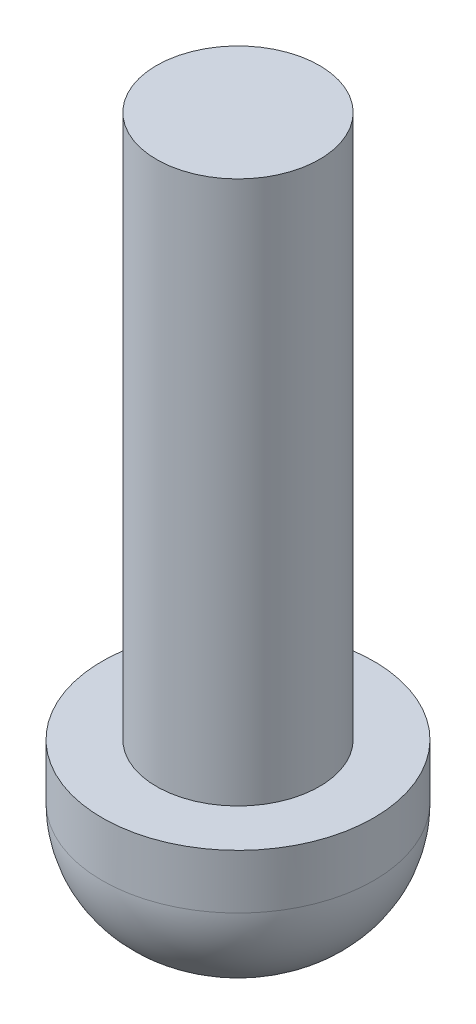
ISO-10303-21;
HEADER;
FILE_DESCRIPTION(('STEP AP214'),'2;1');
FILE_NAME('part.step','',(''),(''),'','','');
FILE_SCHEMA(('AUTOMOTIVE_DESIGN { 1 0 10303 214 1 1 1 1 }'));
ENDSEC;
DATA;
#1=APPLICATION_CONTEXT('core data for automotive mechanical design processes');
#2=APPLICATION_PROTOCOL_DEFINITION('international standard','automotive_design',2000,#1);
#3=PRODUCT_CONTEXT('',#1,'mechanical');
#4=PRODUCT('Part','Part','',(#3));
#5=PRODUCT_RELATED_PRODUCT_CATEGORY('part','',(#4));
#6=PRODUCT_DEFINITION_FORMATION('','',#4);
#7=PRODUCT_DEFINITION_CONTEXT('part definition',#1,'design');
#8=PRODUCT_DEFINITION('design','',#6,#7);
#9=PRODUCT_DEFINITION_SHAPE('','',#8);
#10=(LENGTH_UNIT() NAMED_UNIT(*) SI_UNIT(.MILLI.,.METRE.));
#11=(NAMED_UNIT(*) PLANE_ANGLE_UNIT() SI_UNIT($,.RADIAN.));
#12=(NAMED_UNIT(*) SI_UNIT($,.STERADIAN.) SOLID_ANGLE_UNIT());
#13=UNCERTAINTY_MEASURE_WITH_UNIT(LENGTH_MEASURE(1.E-05),#10,'distance_accuracy_value','');
#14=(GEOMETRIC_REPRESENTATION_CONTEXT(3) GLOBAL_UNCERTAINTY_ASSIGNED_CONTEXT((#13)) GLOBAL_UNIT_ASSIGNED_CONTEXT((#10,
#11,#12)) REPRESENTATION_CONTEXT('',''));
#15=CARTESIAN_POINT('',(0.,0.,0.));
#16=DIRECTION('',(0.,0.,1.));
#17=DIRECTION('',(1.,0.,0.));
#18=AXIS2_PLACEMENT_3D('',#15,#16,#17);
#19=CARTESIAN_POINT('',(0.,10.,0.));
#20=DIRECTION('',(0.,1.,0.));
#21=DIRECTION('',(1.,0.,0.));
#22=AXIS2_PLACEMENT_3D('',#19,#20,#21);
#23=PLANE('',#22);
#24=CARTESIAN_POINT('',(0.,10.,0.));
#25=DIRECTION('',(0.,1.,0.));
#26=DIRECTION('',(1.,0.,0.));
#27=AXIS2_PLACEMENT_3D('',#24,#25,#26);
#28=CIRCLE('',#27,1.5);
#29=CARTESIAN_POINT('',(-1.5,10.,0.));
#30=VERTEX_POINT('',#29);
#31=EDGE_CURVE('E11',#30,#30,#28,.T.);
#32=ORIENTED_EDGE('',*,*,#31,.T.);
#33=EDGE_LOOP('',(#32));
#34=FACE_BOUND('',#33,.T.);
#35=ADVANCED_FACE('F17',(#34),#23,.T.);
#36=CARTESIAN_POINT('',(0.,0.,0.));
#37=DIRECTION('',(0.,1.,0.));
#38=DIRECTION('',(1.,0.,0.));
#39=AXIS2_PLACEMENT_3D('',#36,#37,#38);
#40=CYLINDRICAL_SURFACE('',#39,1.5);
#41=CARTESIAN_POINT('',(0.,0.,0.));
#42=DIRECTION('',(0.,-1.,0.));
#43=DIRECTION('',(1.,0.,0.));
#44=AXIS2_PLACEMENT_3D('',#41,#42,#43);
#45=CIRCLE('',#44,1.5);
#46=CARTESIAN_POINT('',(-1.5,0.,0.));
#47=VERTEX_POINT('',#46);
#48=EDGE_CURVE('E30',#47,#47,#45,.T.);
#49=ORIENTED_EDGE('',*,*,#48,.F.);
#50=EDGE_LOOP('',(#49));
#51=FACE_BOUND('',#50,.T.);
#52=ORIENTED_EDGE('',*,*,#31,.F.);
#53=EDGE_LOOP('',(#52));
#54=FACE_BOUND('',#53,.T.);
#55=ADVANCED_FACE('F592',(#51,#54),#40,.T.);
#56=CARTESIAN_POINT('',(0.,0.,0.));
#57=DIRECTION('',(0.,1.,0.));
#58=DIRECTION('',(1.,0.,0.));
#59=AXIS2_PLACEMENT_3D('',#56,#57,#58);
#60=PLANE('',#59);
#61=ORIENTED_EDGE('',*,*,#48,.T.);
#62=EDGE_LOOP('',(#61));
#63=FACE_BOUND('',#62,.T.);
#64=CARTESIAN_POINT('',(0.,0.,0.));
#65=DIRECTION('',(0.,1.,0.));
#66=DIRECTION('',(-1.,0.,0.));
#67=AXIS2_PLACEMENT_3D('',#64,#65,#66);
#68=CIRCLE('',#67,2.5);
#69=CARTESIAN_POINT('',(2.5,0.,0.));
#70=VERTEX_POINT('',#69);
#71=EDGE_CURVE('E90',#70,#70,#68,.T.);
#72=ORIENTED_EDGE('',*,*,#71,.T.);
#73=EDGE_LOOP('',(#72));
#74=FACE_BOUND('',#73,.T.);
#75=ADVANCED_FACE('F89',(#63,#74),#60,.T.);
#76=CARTESIAN_POINT('',(0.,0.,0.));
#77=DIRECTION('',(0.,-1.,0.));
#78=DIRECTION('',(-1.,0.,0.));
#79=AXIS2_PLACEMENT_3D('',#76,#77,#78);
#80=CYLINDRICAL_SURFACE('',#79,2.5);
#81=CARTESIAN_POINT('',(0.,-1.,0.));
#82=DIRECTION('',(0.,-1.,0.));
#83=DIRECTION('',(-1.,0.,0.));
#84=AXIS2_PLACEMENT_3D('',#81,#82,#83);
#85=CIRCLE('',#84,2.5);
#86=CARTESIAN_POINT('',(2.5,-1.,0.));
#87=VERTEX_POINT('',#86);
#88=CARTESIAN_POINT('',(0.,-1.,2.5));
#89=VERTEX_POINT('',#88);
#90=EDGE_CURVE('E105',#87,#89,#85,.T.);
#91=ORIENTED_EDGE('',*,*,#90,.F.);
#92=CARTESIAN_POINT('',(0.,-1.,0.));
#93=DIRECTION('',(0.,-1.,0.));
#94=DIRECTION('',(-1.,0.,0.));
#95=AXIS2_PLACEMENT_3D('',#92,#93,#94);
#96=CIRCLE('',#95,2.5);
#97=EDGE_CURVE('E163',#89,#87,#96,.T.);
#98=ORIENTED_EDGE('',*,*,#97,.F.);
#99=EDGE_LOOP('',(#91,#98));
#100=FACE_BOUND('',#99,.T.);
#101=ORIENTED_EDGE('',*,*,#71,.F.);
#102=EDGE_LOOP('',(#101));
#103=FACE_BOUND('',#102,.T.);
#104=ADVANCED_FACE('F603',(#100,#103),#80,.T.);
#105=CARTESIAN_POINT('',(-0.417386632650924,-3.,-0.275296928577712));
#106=DIRECTION('',(-0.186616509751668,0.,-0.982432836527824));
#107=DIRECTION('',(-0.982432836527824,0.,0.186616509751668));
#108=AXIS2_PLACEMENT_3D('',#105,#106,#107);
#109=PLANE('',#108);
#110=CARTESIAN_POINT('',(-0.417386632650925,-3.,-0.275296928577712));
#111=CARTESIAN_POINT('',(-0.464273853389436,-3.00005642598224,-0.266670561788805));
#112=CARTESIAN_POINT('',(-0.511235587988266,-2.99909377306004,-0.258377785632426));
#113=CARTESIAN_POINT('',(-0.58596288848384,-2.99557387268779,-0.245105474283203));
#114=CARTESIAN_POINT('',(-0.613773090441924,-2.99382371647033,-0.240149160618557));
#115=CARTESIAN_POINT('',(-0.672466754636964,-2.98909389705395,-0.2294782633294));
#116=CARTESIAN_POINT('',(-0.703337058922493,-2.98599628789804,-0.223741887504033));
#117=CARTESIAN_POINT('',(-0.768216193048915,-2.97812446927156,-0.211471842716828));
#118=CARTESIAN_POINT('',(-0.802203849820698,-2.97320529961422,-0.204918983019769));
#119=CARTESIAN_POINT('',(-0.873322480074087,-2.96115559356099,-0.191033985735932));
#120=CARTESIAN_POINT('',(-0.910422173401683,-2.95385122469379,-0.183690286675776));
#121=CARTESIAN_POINT('',(-0.967043903220003,-2.94107829526599,-0.172445263892615));
#122=CARTESIAN_POINT('',(-0.98672862286903,-2.93633226116336,-0.168528934690961));
#123=CARTESIAN_POINT('',(-1.02684248375918,-2.92602530775528,-0.160557802443036));
#124=CARTESIAN_POINT('',(-1.04726503280705,-2.92043724326718,-0.156504746465074));
#125=CARTESIAN_POINT('',(-1.08882774657363,-2.9083570372805,-0.148289928587405));
#126=CARTESIAN_POINT('',(-1.10996011320697,-2.90183599817425,-0.144131192457723));
#127=CARTESIAN_POINT('',(-1.1529104115441,-2.88779583680887,-0.135754660282906));
#128=CARTESIAN_POINT('',(-1.17471931008087,-2.88024607490424,-0.131541865734934));
#129=CARTESIAN_POINT('',(-1.2211539210414,-2.86325897981294,-0.12264400288936));
#130=CARTESIAN_POINT('',(-1.24574070789602,-2.85370578133819,-0.117976638027123));
#131=CARTESIAN_POINT('',(-1.29623981891198,-2.83291509860176,-0.108399373770314));
#132=CARTESIAN_POINT('',(-1.32212399166951,-2.82160644966243,-0.103495457070596));
#133=CARTESIAN_POINT('',(-1.37510151094352,-2.79709493579706,-0.0934633405284698));
#134=CARTESIAN_POINT('',(-1.40216103816665,-2.78381615675037,-0.0883418668038786));
#135=CARTESIAN_POINT('',(-1.45733645135766,-2.75515195226108,-0.0778892550639663));
#136=CARTESIAN_POINT('',(-1.48541218894427,-2.73968664221135,-0.0725651056931595));
#137=CARTESIAN_POINT('',(-1.54243049731679,-2.70643789023548,-0.0617395572178182));
#138=CARTESIAN_POINT('',(-1.57132625492958,-2.68857146814507,-0.0562462751712473));
#139=CARTESIAN_POINT('',(-1.62975441496184,-2.65031763998745,-0.0451271286847165));
#140=CARTESIAN_POINT('',(-1.65923309423636,-2.62984534174343,-0.0395108360283896));
#141=CARTESIAN_POINT('',(-1.71855417082615,-2.58619309039993,-0.0282046268317497));
#142=CARTESIAN_POINT('',(-1.74833591865345,-2.56292772800826,-0.0225260404351624));
#143=CARTESIAN_POINT('',(-1.80794843911035,-2.51353091370533,-0.0111678305547711));
#144=CARTESIAN_POINT('',(-1.83771200470389,-2.4873152839304,-0.00550142335331249));
#145=CARTESIAN_POINT('',(-1.86667288706595,-2.46020725233058,0.));
#146=B_SPLINE_CURVE_WITH_KNOTS('',3,(#110,#111,#112,#113,#114,#115,#116,#117,#118,#119,#120,
#121,#122,#123,#124,#125,#126,#127,#128,#129,#130,#131,#132,#133,#134,#135,#136,#137,#138,#139,
#140,#141,#142,#143,#144,#145),.UNSPECIFIED.,.F.,.F.,(4,2,2,2,2,2,2,2,2,2,2,2,2,2,2,2,2,4),(0.,
0.143022375074927,0.227917127496093,0.322543845999278,0.42739192817745,0.542887042197384,
0.604751783126982,0.669414207103448,0.736911873290066,0.807278150500668,0.88761887627633,
0.973601011306392,1.06529182557611,1.16273178046567,1.26592963372248,1.37485700559365,
1.4894426502269,1.60956672638445),.UNSPECIFIED.);
#147=CARTESIAN_POINT('',(-0.417386632650925,-3.,-0.275296928577712));
#148=VERTEX_POINT('',#147);
#149=CARTESIAN_POINT('',(-1.86667288706595,-2.46020725233058,0.));
#150=VERTEX_POINT('',#149);
#151=EDGE_CURVE('E424',#148,#150,#146,.T.);
#152=ORIENTED_EDGE('',*,*,#151,.F.);
#153=DIRECTION('',(0.,1.,0.));
#154=VECTOR('',#153,1.);
#155=CARTESIAN_POINT('',(-0.417386632650925,-3.,-0.275296928577712));
#156=LINE('',#155,#154);
#157=CARTESIAN_POINT('',(-0.417386632650925,-1.,-0.275296928577712));
#158=VERTEX_POINT('',#157);
#159=EDGE_CURVE('E401',#148,#158,#156,.T.);
#160=ORIENTED_EDGE('',*,*,#159,.T.);
#161=DIRECTION('',(-0.982432836527824,0.,0.186616509751668));
#162=VECTOR('',#161,1.);
#163=CARTESIAN_POINT('',(-1.86667288706595,-1.,0.));
#164=LINE('',#163,#162);
#165=CARTESIAN_POINT('',(-1.86667288706595,-1.,0.));
#166=VERTEX_POINT('',#165);
#167=EDGE_CURVE('E153',#158,#166,#164,.T.);
#168=ORIENTED_EDGE('',*,*,#167,.T.);
#169=DIRECTION('',(0.,1.,0.));
#170=VECTOR('',#169,1.);
#171=CARTESIAN_POINT('',(-1.86667288706595,-3.,0.));
#172=LINE('',#171,#170);
#173=EDGE_CURVE('E91',#150,#166,#172,.T.);
#174=ORIENTED_EDGE('',*,*,#173,.F.);
#175=EDGE_LOOP('',(#152,#160,#168,#174));
#176=FACE_BOUND('',#175,.T.);
#177=ADVANCED_FACE('F200',(#176),#109,.F.);
#178=CARTESIAN_POINT('',(-0.417386632650924,-3.,0.275296928577712));
#179=DIRECTION('',(0.186616509751668,0.,-0.982432836527824));
#180=DIRECTION('',(0.,-1.,0.));
#181=AXIS2_PLACEMENT_3D('',#178,#179,#180);
#182=PLANE('',#181);
#183=CARTESIAN_POINT('',(-1.86667288706595,-2.46020725233058,0.));
#184=CARTESIAN_POINT('',(-1.8377182513495,-2.48730943545658,0.00550023057495743));
#185=CARTESIAN_POINT('',(-1.80796130126467,-2.51351958266544,0.0111655815361506));
#186=CARTESIAN_POINT('',(-1.74836071527282,-2.56290781316947,0.0225221958720095));
#187=CARTESIAN_POINT('',(-1.71858418104794,-2.58616994326433,0.028200250640021));
#188=CARTESIAN_POINT('',(-1.65927187348047,-2.62981776130239,0.0395058342102261));
#189=CARTESIAN_POINT('',(-1.62979666125676,-2.65028873222602,0.0451220423259053));
#190=CARTESIAN_POINT('',(-1.57137350253646,-2.68854157188077,0.0562413429384201));
#191=CARTESIAN_POINT('',(-1.54247920764307,-2.70640821466527,0.0617348772549942));
#192=CARTESIAN_POINT('',(-1.48546170194053,-2.73965871393465,0.0725611290766999));
#193=CARTESIAN_POINT('',(-1.45738524845235,-2.75512544308298,0.0778857489333687));
#194=CARTESIAN_POINT('',(-1.40220615810483,-2.78379345586383,0.0883393283925251));
#195=CARTESIAN_POINT('',(-1.37514362835924,-2.7970745286354,0.0934613287299921));
#196=CARTESIAN_POINT('',(-1.32215781161119,-2.82159128710229,0.103494439289411));
#197=CARTESIAN_POINT('',(-1.29626831494911,-2.83290280480535,0.108398860123462));
#198=CARTESIAN_POINT('',(-1.24575621168436,-2.8536996426799,0.117976629246365));
#199=CARTESIAN_POINT('',(-1.22116174170851,-2.86325605692106,0.122644062782587));
#200=CARTESIAN_POINT('',(-1.17472040343866,-2.88024572909231,0.131540291714795));
#201=CARTESIAN_POINT('',(-1.15291258672524,-2.88779520018727,0.135751370983225));
#202=CARTESIAN_POINT('',(-1.10996437277675,-2.90183486829558,0.144125058102641));
#203=CARTESIAN_POINT('',(-1.08883300353616,-2.90835569919574,0.14828264519185));
#204=CARTESIAN_POINT('',(-1.04727215898853,-2.92043558089303,0.156495490981718));
#205=CARTESIAN_POINT('',(-1.02685047820729,-2.92602352306661,0.160547713874002));
#206=CARTESIAN_POINT('',(-0.986738223809797,-2.93633030302391,0.168517515402044));
#207=CARTESIAN_POINT('',(-0.967054238894512,-2.94107628035024,0.172433335577649));
#208=CARTESIAN_POINT('',(-0.910434217694771,-2.95384918141395,0.183677323304803));
#209=CARTESIAN_POINT('',(-0.873335551202937,-2.96115357858895,0.191020784534667));
#210=CARTESIAN_POINT('',(-0.802218352843852,-2.97320349013574,0.204906141553028));
#211=CARTESIAN_POINT('',(-0.768231083617263,-2.97812280169535,0.21145953353553));
#212=CARTESIAN_POINT('',(-0.703352060656074,-2.98599497105249,0.223731143278222));
#213=CARTESIAN_POINT('',(-0.672481469345751,-2.98909276070816,0.229468506917461));
#214=CARTESIAN_POINT('',(-0.613786561606485,-2.99382294785161,0.240141604535061));
#215=CARTESIAN_POINT('',(-0.585975398214346,-2.99557326943426,0.245099105955014));
#216=CARTESIAN_POINT('',(-0.511243365548929,-2.99909363266535,0.258374756279598));
#217=CARTESIAN_POINT('',(-0.464277820052036,-3.00005641655402,0.266669527671575));
#218=CARTESIAN_POINT('',(-0.417386632650924,-3.,0.275296928577712));
#219=B_SPLINE_CURVE_WITH_KNOTS('',3,(#183,#184,#185,#186,#187,#188,#189,#190,#191,#192,#193,
#194,#195,#196,#197,#198,#199,#200,#201,#202,#203,#204,#205,#206,#207,#208,#209,#210,#211,#212,
#213,#214,#215,#216,#217,#218),.UNSPECIFIED.,.F.,.F.,(4,2,2,2,2,2,2,2,2,2,2,2,2,2,2,2,2,4),(0.,
0.120098167701528,0.234665511610209,0.343582175485884,0.446776813545414,0.544220878492738,
0.635922908244617,0.72192310444428,0.802288446028236,0.872650503352188,0.94014454021708,
1.00480393221331,1.06666624007608,1.18215826996053,1.28700558328205,1.38163373681147,
1.46653197719137,1.60956663764364),.UNSPECIFIED.);
#220=CARTESIAN_POINT('',(-0.417386632650925,-3.,0.275296928577712));
#221=VERTEX_POINT('',#220);
#222=EDGE_CURVE('E176',#150,#221,#219,.T.);
#223=ORIENTED_EDGE('',*,*,#222,.F.);
#224=ORIENTED_EDGE('',*,*,#173,.T.);
#225=DIRECTION('',(-0.982432836527824,0.,-0.186616509751668));
#226=VECTOR('',#225,1.);
#227=CARTESIAN_POINT('',(-1.86667288706595,-1.,0.));
#228=LINE('',#227,#226);
#229=CARTESIAN_POINT('',(-0.417386632650925,-1.,0.275296928577712));
#230=VERTEX_POINT('',#229);
#231=EDGE_CURVE('E149',#230,#166,#228,.T.);
#232=ORIENTED_EDGE('',*,*,#231,.F.);
#233=DIRECTION('',(0.,1.,0.));
#234=VECTOR('',#233,1.);
#235=CARTESIAN_POINT('',(-0.417386632650925,-3.,0.275296928577712));
#236=LINE('',#235,#234);
#237=EDGE_CURVE('E126',#221,#230,#236,.T.);
#238=ORIENTED_EDGE('',*,*,#237,.F.);
#239=EDGE_LOOP('',(#223,#224,#232,#238));
#240=FACE_BOUND('',#239,.T.);
#241=ADVANCED_FACE('F198',(#240),#182,.T.);
#242=CARTESIAN_POINT('',(0.,-1.,2.5));
#243=CARTESIAN_POINT('',(-2.5,-1.,2.5));
#244=CARTESIAN_POINT('',(-2.5,-1.,0.));
#245=CARTESIAN_POINT('',(-2.5,-1.,-2.5));
#246=CARTESIAN_POINT('',(0.,-1.,-2.5));
#247=CARTESIAN_POINT('',(2.5,-1.,-2.5));
#248=CARTESIAN_POINT('',(2.5,-1.,0.));
#249=CARTESIAN_POINT('',(2.5,-1.,2.5));
#250=CARTESIAN_POINT('',(0.,-1.,2.5));
#251=CARTESIAN_POINT('',(0.,-3.,2.5));
#252=CARTESIAN_POINT('',(-2.5,-3.,2.5));
#253=CARTESIAN_POINT('',(-2.5,-3.,0.));
#254=CARTESIAN_POINT('',(-2.5,-3.,-2.5));
#255=CARTESIAN_POINT('',(0.,-3.,-2.5));
#256=CARTESIAN_POINT('',(2.5,-3.,-2.5));
#257=CARTESIAN_POINT('',(2.5,-3.,0.));
#258=CARTESIAN_POINT('',(2.5,-3.,2.5));
#259=CARTESIAN_POINT('',(0.,-3.,2.5));
#260=CARTESIAN_POINT('',(0.,-3.,0.5));
#261=CARTESIAN_POINT('',(-0.499999999999999,-3.,0.499999999999999));
#262=CARTESIAN_POINT('',(-0.5,-3.,0.));
#263=CARTESIAN_POINT('',(-0.499999999999999,-3.,-0.499999999999999));
#264=CARTESIAN_POINT('',(0.,-3.,-0.5));
#265=CARTESIAN_POINT('',(0.499999999999999,-3.,-0.499999999999999));
#266=CARTESIAN_POINT('',(0.5,-3.,0.));
#267=CARTESIAN_POINT('',(0.499999999999999,-3.,0.499999999999999));
#268=CARTESIAN_POINT('',(0.,-3.,0.5));
#269=(BOUNDED_SURFACE() B_SPLINE_SURFACE(2,2,((#242,#243,#244,#245,#246,#247,#248,#249,#250),
(#251,#252,#253,#254,#255,#256,#257,#258,#259),(#260,#261,#262,#263,#264,#265,#266,#267,#268)),
.UNSPECIFIED.,.F.,.T.,.F.) B_SPLINE_SURFACE_WITH_KNOTS((3,3),(3,2,2,2,3),(0.,1.5707963267949),
(-3.14159265358979,-1.5707963267949,0.,1.5707963267949,3.14159265358979),
.UNSPECIFIED.) GEOMETRIC_REPRESENTATION_ITEM() RATIONAL_B_SPLINE_SURFACE(((1.,0.707106781186548,
1.,0.707106781186548,1.,0.707106781186548,1.,0.707106781186548,1.),(0.707106781186548,0.5,
0.707106781186548,0.5,0.707106781186548,0.5,0.707106781186548,0.5,0.707106781186548),(1.,
0.707106781186548,1.,0.707106781186548,1.,0.707106781186548,1.,0.707106781186548,1.))) REPRESENTATION_ITEM('') SURFACE());
#270=CARTESIAN_POINT('',(0.,-2.46020725233058,1.86667288706595));
#271=CARTESIAN_POINT('',(0.00550023057495841,-2.48730943545658,1.8377182513495));
#272=CARTESIAN_POINT('',(0.0111655815361515,-2.51351958266544,1.80796130126467));
#273=CARTESIAN_POINT('',(0.0225221958720098,-2.56290781316947,1.74836071527282));
#274=CARTESIAN_POINT('',(0.0282002506400208,-2.58616994326433,1.71858418104794));
#275=CARTESIAN_POINT('',(0.0395058342102259,-2.6298177613024,1.65927187348047));
#276=CARTESIAN_POINT('',(0.0451220423259054,-2.65028873222602,1.62979666125677));
#277=CARTESIAN_POINT('',(0.0562413429384205,-2.68854157188077,1.57137350253646));
#278=CARTESIAN_POINT('',(0.0617348772549946,-2.70640821466527,1.54247920764307));
#279=CARTESIAN_POINT('',(0.0725611290767003,-2.73965871393465,1.48546170194053));
#280=CARTESIAN_POINT('',(0.0778857489333692,-2.75512544308298,1.45738524845235));
#281=CARTESIAN_POINT('',(0.0883393283925252,-2.78379345586383,1.40220615810483));
#282=CARTESIAN_POINT('',(0.0934613287299919,-2.7970745286354,1.37514362835924));
#283=CARTESIAN_POINT('',(0.103494439289411,-2.82159128710229,1.32215781161119));
#284=CARTESIAN_POINT('',(0.108398860123462,-2.83290280480535,1.29626831494911));
#285=CARTESIAN_POINT('',(0.117976629246366,-2.8536996426799,1.24575621168436));
#286=CARTESIAN_POINT('',(0.122644062782587,-2.86325605692106,1.22116174170851));
#287=CARTESIAN_POINT('',(0.131540291714795,-2.88024572909231,1.17472040343866));
#288=CARTESIAN_POINT('',(0.135751370983225,-2.88779520018727,1.15291258672524));
#289=CARTESIAN_POINT('',(0.14412505810264,-2.90183486829558,1.10996437277675));
#290=CARTESIAN_POINT('',(0.14828264519185,-2.90835569919574,1.08883300353616));
#291=CARTESIAN_POINT('',(0.156495490981717,-2.92043558089303,1.04727215898853));
#292=CARTESIAN_POINT('',(0.160547713874002,-2.92602352306661,1.02685047820729));
#293=CARTESIAN_POINT('',(0.168517515402044,-2.93633030302391,0.986738223809797));
#294=CARTESIAN_POINT('',(0.172433335577649,-2.94107628035024,0.967054238894512));
#295=CARTESIAN_POINT('',(0.183677323304803,-2.95384918141395,0.910434217694771));
#296=CARTESIAN_POINT('',(0.191020784534667,-2.96115357858895,0.873335551202937));
#297=CARTESIAN_POINT('',(0.204906141553028,-2.97320349013574,0.802218352843852));
#298=CARTESIAN_POINT('',(0.21145953353553,-2.97812280169535,0.768231083617263));
#299=CARTESIAN_POINT('',(0.223731143278222,-2.98599497105249,0.703352060656074));
#300=CARTESIAN_POINT('',(0.229468506917461,-2.98909276070816,0.672481469345751));
#301=CARTESIAN_POINT('',(0.240141604535061,-2.99382294785161,0.613786561606485));
#302=CARTESIAN_POINT('',(0.245099105955014,-2.99557326943426,0.585975398214346));
#303=CARTESIAN_POINT('',(0.258374756279598,-2.99909363266535,0.511243365548928));
#304=CARTESIAN_POINT('',(0.266669527671575,-3.00005641655402,0.464277820052036));
#305=CARTESIAN_POINT('',(0.275296928577712,-3.,0.417386632650924));
#306=B_SPLINE_CURVE_WITH_KNOTS('',3,(#270,#271,#272,#273,#274,#275,#276,#277,#278,#279,#280,
#281,#282,#283,#284,#285,#286,#287,#288,#289,#290,#291,#292,#293,#294,#295,#296,#297,#298,#299,
#300,#301,#302,#303,#304,#305),.UNSPECIFIED.,.F.,.F.,(4,2,2,2,2,2,2,2,2,2,2,2,2,2,2,2,2,4),(0.,
0.120098167701527,0.234665511610208,0.343582175485883,0.446776813545412,0.544220878492737,
0.635922908244616,0.721923104444279,0.802288446028236,0.872650503352189,0.94014454021708,
1.00480393221331,1.06666624007608,1.18215826996053,1.28700558328205,1.38163373681148,
1.46653197719137,1.60956663764364),.UNSPECIFIED.);
#307=CARTESIAN_POINT('',(0.,-2.46020725233058,1.86667288706595));
#308=VERTEX_POINT('',#307);
#309=CARTESIAN_POINT('',(0.275296928577712,-3.,0.417386632650925));
#310=VERTEX_POINT('',#309);
#311=EDGE_CURVE('E130',#308,#310,#306,.T.);
#312=CARTESIAN_POINT('',(0.,-3.,0.));
#313=DIRECTION('',(0.,1.,0.));
#314=DIRECTION('',(-1.,0.,0.));
#315=AXIS2_PLACEMENT_3D('',#312,#313,#314);
#316=CIRCLE('',#315,0.5);
#317=CARTESIAN_POINT('',(0.417386632650925,-3.,0.275296928577712));
#318=VERTEX_POINT('',#317);
#319=EDGE_CURVE('E308',#310,#318,#316,.T.);
#320=CARTESIAN_POINT('',(0.417386632650924,-3.,0.275296928577712));
#321=CARTESIAN_POINT('',(0.464273853389483,-3.00005642598224,0.266670561788793));
#322=CARTESIAN_POINT('',(0.511235587988359,-2.99909377306003,0.258377785632391));
#323=CARTESIAN_POINT('',(0.58596288848399,-2.99557387268778,0.245105474283129));
#324=CARTESIAN_POINT('',(0.613773090442085,-2.99382371647032,0.240149160618468));
#325=CARTESIAN_POINT('',(0.67246675463714,-2.98909389705394,0.229478263329285));
#326=CARTESIAN_POINT('',(0.703337058922673,-2.98599628789802,0.223741887503906));
#327=CARTESIAN_POINT('',(0.768216193049093,-2.97812446927154,0.211471842716682));
#328=CARTESIAN_POINT('',(0.802203849820872,-2.9732052996142,0.204918983019617));
#329=CARTESIAN_POINT('',(0.873322480074243,-2.96115559356096,0.191033985735776));
#330=CARTESIAN_POINT('',(0.910422173401827,-2.95385122469377,0.183690286675623));
#331=CARTESIAN_POINT('',(0.967043903220127,-2.94107829526596,0.172445263892474));
#332=CARTESIAN_POINT('',(0.986728622869144,-2.93633226116334,0.168528934690826));
#333=CARTESIAN_POINT('',(1.02684248375927,-2.92602530775526,0.160557802442916));
#334=CARTESIAN_POINT('',(1.04726503280713,-2.92043724326716,0.156504746464964));
#335=CARTESIAN_POINT('',(1.08882774657369,-2.90835703728049,0.148289928587319));
#336=CARTESIAN_POINT('',(1.10996011320702,-2.90183599817424,0.144131192457651));
#337=CARTESIAN_POINT('',(1.15291041154412,-2.88779583680886,0.135754660282867));
#338=CARTESIAN_POINT('',(1.17471931008088,-2.88024607490424,0.131541865734916));
#339=CARTESIAN_POINT('',(1.22115392104149,-2.8632589798129,0.122644002889361));
#340=CARTESIAN_POINT('',(1.24574070789621,-2.85370578133812,0.117976638027124));
#341=CARTESIAN_POINT('',(1.29623981891232,-2.83291509860161,0.108399373770309));
#342=CARTESIAN_POINT('',(1.32212399166991,-2.82160644966225,0.103495457070585));
#343=CARTESIAN_POINT('',(1.37510151094403,-2.79709493579681,0.0934633405284467));
#344=CARTESIAN_POINT('',(1.40216103816719,-2.7838161567501,0.0883418668038493));
#345=CARTESIAN_POINT('',(1.45733645135824,-2.75515195226077,0.0778892550639257));
#346=CARTESIAN_POINT('',(1.48541218894486,-2.73968664221102,0.0725651056931135));
#347=CARTESIAN_POINT('',(1.54243049731737,-2.70643789023512,0.0617395572177638));
#348=CARTESIAN_POINT('',(1.57132625493015,-2.68857146814471,0.0562462751711897));
#349=CARTESIAN_POINT('',(1.62975441496234,-2.6503176399871,0.0451271286846565));
#350=CARTESIAN_POINT('',(1.65923309423682,-2.6298453417431,0.0395108360283303));
#351=CARTESIAN_POINT('',(1.71855417082651,-2.58619309039966,0.028204626831698));
#352=CARTESIAN_POINT('',(1.74833591865375,-2.56292772800802,0.0225260404351173));
#353=CARTESIAN_POINT('',(1.80794843911051,-2.51353091370519,0.0111678305547452));
#354=CARTESIAN_POINT('',(1.83771200470396,-2.48731528393033,0.00550142335329907));
#355=CARTESIAN_POINT('',(1.86667288706595,-2.46020725233058,0.));
#356=B_SPLINE_CURVE_WITH_KNOTS('',3,(#320,#321,#322,#323,#324,#325,#326,#327,#328,#329,#330,
#331,#332,#333,#334,#335,#336,#337,#338,#339,#340,#341,#342,#343,#344,#345,#346,#347,#348,#349,
#350,#351,#352,#353,#354,#355),.UNSPECIFIED.,.F.,.F.,(4,2,2,2,2,2,2,2,2,2,2,2,2,2,2,2,2,4),(0.,
0.143022375075074,0.227917127496282,0.322543845999484,0.427391928177647,0.542887042197544,
0.604751783127113,0.669414207103543,0.736911873290117,0.807278150500668,0.887618876276626,
0.973601011306904,1.06529182557676,1.16273178046636,1.26592963372314,1.37485700559417,
1.4894426502272,1.60956672638445),.UNSPECIFIED.);
#357=CARTESIAN_POINT('',(1.86667288706595,-2.46020725233058,0.));
#358=VERTEX_POINT('',#357);
#359=EDGE_CURVE('E162',#318,#358,#356,.T.);
#360=CARTESIAN_POINT('',(1.86667288706595,-2.46020725233058,0.));
#361=CARTESIAN_POINT('',(1.8377182513495,-2.48730943545658,-0.00550023057495722));
#362=CARTESIAN_POINT('',(1.80796130126467,-2.51351958266544,-0.0111655815361503));
#363=CARTESIAN_POINT('',(1.74836071527282,-2.56290781316947,-0.0225221958720093));
#364=CARTESIAN_POINT('',(1.71858418104794,-2.58616994326433,-0.0282002506400208));
#365=CARTESIAN_POINT('',(1.65927187348047,-2.6298177613024,-0.0395058342102258));
#366=CARTESIAN_POINT('',(1.62979666125676,-2.65028873222602,-0.0451220423259048));
#367=CARTESIAN_POINT('',(1.57137350253646,-2.68854157188077,-0.0562413429384196));
#368=CARTESIAN_POINT('',(1.54247920764307,-2.70640821466526,-0.0617348772549939));
#369=CARTESIAN_POINT('',(1.48546170194053,-2.73965871393465,-0.0725611290766995));
#370=CARTESIAN_POINT('',(1.45738524845235,-2.75512544308298,-0.0778857489333681));
#371=CARTESIAN_POINT('',(1.40220615810483,-2.78379345586383,-0.0883393283925245));
#372=CARTESIAN_POINT('',(1.37514362835924,-2.7970745286354,-0.0934613287299917));
#373=CARTESIAN_POINT('',(1.32215781161119,-2.82159128710229,-0.103494439289411));
#374=CARTESIAN_POINT('',(1.29626831494911,-2.83290280480535,-0.108398860123461));
#375=CARTESIAN_POINT('',(1.24575621168436,-2.8536996426799,-0.117976629246365));
#376=CARTESIAN_POINT('',(1.22116174170851,-2.86325605692106,-0.122644062782586));
#377=CARTESIAN_POINT('',(1.17472040343866,-2.88024572909231,-0.131540291714794));
#378=CARTESIAN_POINT('',(1.15291258672524,-2.88779520018727,-0.135751370983224));
#379=CARTESIAN_POINT('',(1.10996437277675,-2.90183486829558,-0.144125058102639));
#380=CARTESIAN_POINT('',(1.08883300353616,-2.90835569919574,-0.148282645191849));
#381=CARTESIAN_POINT('',(1.04727215898853,-2.92043558089303,-0.156495490981716));
#382=CARTESIAN_POINT('',(1.02685047820729,-2.92602352306661,-0.160547713874001));
#383=CARTESIAN_POINT('',(0.986738223809797,-2.93633030302391,-0.168517515402043));
#384=CARTESIAN_POINT('',(0.967054238894513,-2.94107628035024,-0.172433335577648));
#385=CARTESIAN_POINT('',(0.910434217694771,-2.95384918141395,-0.183677323304802));
#386=CARTESIAN_POINT('',(0.873335551202937,-2.96115357858895,-0.191020784534666));
#387=CARTESIAN_POINT('',(0.802218352843852,-2.97320349013574,-0.204906141553026));
#388=CARTESIAN_POINT('',(0.768231083617263,-2.97812280169535,-0.211459533535529));
#389=CARTESIAN_POINT('',(0.703352060656075,-2.98599497105249,-0.22373114327822));
#390=CARTESIAN_POINT('',(0.672481469345752,-2.98909276070816,-0.22946850691746));
#391=CARTESIAN_POINT('',(0.613786561606486,-2.99382294785161,-0.24014160453506));
#392=CARTESIAN_POINT('',(0.585975398214347,-2.99557326943426,-0.245099105955013));
#393=CARTESIAN_POINT('',(0.511243365548929,-2.99909363266536,-0.258374756279597));
#394=CARTESIAN_POINT('',(0.464277820052036,-3.00005641655403,-0.266669527671575));
#395=CARTESIAN_POINT('',(0.417386632650925,-3.,-0.275296928577712));
#396=B_SPLINE_CURVE_WITH_KNOTS('',3,(#360,#361,#362,#363,#364,#365,#366,#367,#368,#369,#370,
#371,#372,#373,#374,#375,#376,#377,#378,#379,#380,#381,#382,#383,#384,#385,#386,#387,#388,#389,
#390,#391,#392,#393,#394,#395),.UNSPECIFIED.,.F.,.F.,(4,2,2,2,2,2,2,2,2,2,2,2,2,2,2,2,2,4),(0.,
0.120098167701527,0.234665511610208,0.343582175485882,0.446776813545412,0.544220878492736,
0.635922908244616,0.721923104444278,0.802288446028235,0.872650503352188,0.94014454021708,
1.00480393221331,1.06666624007608,1.18215826996053,1.28700558328205,1.38163373681147,
1.46653197719137,1.60956663764364),.UNSPECIFIED.);
#397=CARTESIAN_POINT('',(0.417386632650925,-3.,-0.275296928577712));
#398=VERTEX_POINT('',#397);
#399=EDGE_CURVE('E135',#358,#398,#396,.T.);
#400=CARTESIAN_POINT('',(0.,-3.,0.));
#401=DIRECTION('',(0.,1.,0.));
#402=DIRECTION('',(-1.,0.,0.));
#403=AXIS2_PLACEMENT_3D('',#400,#401,#402);
#404=CIRCLE('',#403,0.5);
#405=CARTESIAN_POINT('',(0.275296928577712,-3.,-0.417386632650925));
#406=VERTEX_POINT('',#405);
#407=EDGE_CURVE('E407',#398,#406,#404,.T.);
#408=CARTESIAN_POINT('',(0.275296928577712,-3.,-0.417386632650925));
#409=CARTESIAN_POINT('',(0.266670561788805,-3.00005642598224,-0.464273853389436));
#410=CARTESIAN_POINT('',(0.258377785632427,-2.99909377306004,-0.511235587988266));
#411=CARTESIAN_POINT('',(0.245105474283204,-2.99557387268779,-0.58596288848384));
#412=CARTESIAN_POINT('',(0.240149160618557,-2.99382371647033,-0.613773090441924));
#413=CARTESIAN_POINT('',(0.2294782633294,-2.98909389705395,-0.672466754636964));
#414=CARTESIAN_POINT('',(0.223741887504033,-2.98599628789804,-0.703337058922493));
#415=CARTESIAN_POINT('',(0.211471842716828,-2.97812446927156,-0.768216193048915));
#416=CARTESIAN_POINT('',(0.20491898301977,-2.97320529961422,-0.802203849820698));
#417=CARTESIAN_POINT('',(0.191033985735933,-2.96115559356098,-0.873322480074087));
#418=CARTESIAN_POINT('',(0.183690286675777,-2.95385122469379,-0.910422173401683));
#419=CARTESIAN_POINT('',(0.172445263892616,-2.94107829526599,-0.967043903220003));
#420=CARTESIAN_POINT('',(0.168528934690962,-2.93633226116336,-0.98672862286903));
#421=CARTESIAN_POINT('',(0.160557802443037,-2.92602530775528,-1.02684248375918));
#422=CARTESIAN_POINT('',(0.156504746465075,-2.92043724326718,-1.04726503280705));
#423=CARTESIAN_POINT('',(0.148289928587406,-2.9083570372805,-1.08882774657363));
#424=CARTESIAN_POINT('',(0.144131192457725,-2.90183599817425,-1.10996011320697));
#425=CARTESIAN_POINT('',(0.135754660282907,-2.88779583680887,-1.1529104115441));
#426=CARTESIAN_POINT('',(0.131541865734935,-2.88024607490424,-1.17471931008087));
#427=CARTESIAN_POINT('',(0.122644002889361,-2.86325897981294,-1.2211539210414));
#428=CARTESIAN_POINT('',(0.117976638027125,-2.85370578133819,-1.24574070789602));
#429=CARTESIAN_POINT('',(0.108399373770316,-2.83291509860176,-1.29623981891198));
#430=CARTESIAN_POINT('',(0.103495457070598,-2.82160644966243,-1.32212399166951));
#431=CARTESIAN_POINT('',(0.0934633405284719,-2.79709493579706,-1.37510151094352));
#432=CARTESIAN_POINT('',(0.0883418668038809,-2.78381615675037,-1.40216103816665));
#433=CARTESIAN_POINT('',(0.0778892550639688,-2.75515195226108,-1.45733645135766));
#434=CARTESIAN_POINT('',(0.0725651056931619,-2.73968664221135,-1.48541218894427));
#435=CARTESIAN_POINT('',(0.0617395572178206,-2.70643789023548,-1.54243049731679));
#436=CARTESIAN_POINT('',(0.0562462751712497,-2.68857146814507,-1.57132625492958));
#437=CARTESIAN_POINT('',(0.0451271286847185,-2.65031763998745,-1.62975441496184));
#438=CARTESIAN_POINT('',(0.0395108360283912,-2.62984534174343,-1.65923309423636));
#439=CARTESIAN_POINT('',(0.028204626831751,-2.58619309039993,-1.71855417082615));
#440=CARTESIAN_POINT('',(0.0225260404351637,-2.56292772800826,-1.74833591865345));
#441=CARTESIAN_POINT('',(0.011167830554772,-2.51353091370533,-1.80794843911035));
#442=CARTESIAN_POINT('',(0.00550142335331311,-2.4873152839304,-1.83771200470389));
#443=CARTESIAN_POINT('',(0.,-2.46020725233058,-1.86667288706595));
#444=B_SPLINE_CURVE_WITH_KNOTS('',3,(#408,#409,#410,#411,#412,#413,#414,#415,#416,#417,#418,
#419,#420,#421,#422,#423,#424,#425,#426,#427,#428,#429,#430,#431,#432,#433,#434,#435,#436,#437,
#438,#439,#440,#441,#442,#443),.UNSPECIFIED.,.F.,.F.,(4,2,2,2,2,2,2,2,2,2,2,2,2,2,2,2,2,4),(0.,
0.143022375074927,0.227917127496093,0.322543845999278,0.42739192817745,0.542887042197384,
0.604751783126982,0.669414207103448,0.736911873290066,0.807278150500668,0.88761887627633,
0.973601011306392,1.06529182557611,1.16273178046567,1.26592963372248,1.37485700559365,
1.48944265022689,1.60956672638445),.UNSPECIFIED.);
#445=CARTESIAN_POINT('',(0.,-2.46020725233058,-1.86667288706595));
#446=VERTEX_POINT('',#445);
#447=EDGE_CURVE('E339',#406,#446,#444,.T.);
#448=CARTESIAN_POINT('',(0.,-2.46020725233058,-1.86667288706595));
#449=CARTESIAN_POINT('',(-0.00550023057496713,-2.48730943545663,-1.83771825134944));
#450=CARTESIAN_POINT('',(-0.0111655815361701,-2.51351958266554,-1.80796130126456));
#451=CARTESIAN_POINT('',(-0.022522195872044,-2.56290781316965,-1.7483607152726));
#452=CARTESIAN_POINT('',(-0.0282002506400605,-2.58616994326454,-1.71858418104768));
#453=CARTESIAN_POINT('',(-0.0395058342102714,-2.62981776130264,-1.65927187348013));
#454=CARTESIAN_POINT('',(-0.0451220423259512,-2.65028873222628,-1.62979666125639));
#455=CARTESIAN_POINT('',(-0.0562413429384649,-2.68854157188104,-1.57137350253604));
#456=CARTESIAN_POINT('',(-0.0617348772550371,-2.70640821466553,-1.54247920764264));
#457=CARTESIAN_POINT('',(-0.0725611290767368,-2.73965871393489,-1.48546170194009));
#458=CARTESIAN_POINT('',(-0.0778857489334014,-2.75512544308322,-1.45738524845192));
#459=CARTESIAN_POINT('',(-0.0883393283925492,-2.78379345586403,-1.40220615810443));
#460=CARTESIAN_POINT('',(-0.0934613287300115,-2.79707452863558,-1.37514362835886));
#461=CARTESIAN_POINT('',(-0.103494439289421,-2.82159128710242,-1.32215781161089));
#462=CARTESIAN_POINT('',(-0.108398860123468,-2.83290280480546,-1.29626831494886));
#463=CARTESIAN_POINT('',(-0.117976629246367,-2.85369964267996,-1.24575621168422));
#464=CARTESIAN_POINT('',(-0.122644062782588,-2.86325605692108,-1.22116174170844));
#465=CARTESIAN_POINT('',(-0.13154029171481,-2.88024572909231,-1.17472040343865));
#466=CARTESIAN_POINT('',(-0.135751370983254,-2.88779520018728,-1.15291258672522));
#467=CARTESIAN_POINT('',(-0.144125058102695,-2.90183486829559,-1.10996437277671));
#468=CARTESIAN_POINT('',(-0.148282645191914,-2.90835569919575,-1.08883300353611));
#469=CARTESIAN_POINT('',(-0.156495490981799,-2.92043558089304,-1.04727215898847));
#470=CARTESIAN_POINT('',(-0.160547713874091,-2.92602352306663,-1.02685047820721));
#471=CARTESIAN_POINT('',(-0.168517515402145,-2.93633030302393,-0.986738223809712));
#472=CARTESIAN_POINT('',(-0.172433335577754,-2.94107628035026,-0.967054238894421));
#473=CARTESIAN_POINT('',(-0.183677323304917,-2.95384918141397,-0.910434217694665));
#474=CARTESIAN_POINT('',(-0.191020784534783,-2.96115357858897,-0.873335551202821));
#475=CARTESIAN_POINT('',(-0.20490614155314,-2.97320349013575,-0.802218352843723));
#476=CARTESIAN_POINT('',(-0.211459533535637,-2.97812280169537,-0.768231083617131));
#477=CARTESIAN_POINT('',(-0.223731143278315,-2.9859949710525,-0.703352060655941));
#478=CARTESIAN_POINT('',(-0.229468506917546,-2.98909276070817,-0.672481469345621));
#479=CARTESIAN_POINT('',(-0.240141604535127,-2.99382294785162,-0.613786561606366));
#480=CARTESIAN_POINT('',(-0.245099105955069,-2.99557326943427,-0.585975398214235));
#481=CARTESIAN_POINT('',(-0.258374756279623,-2.99909363266536,-0.51124336554886));
#482=CARTESIAN_POINT('',(-0.266669527671583,-3.00005641655402,-0.464277820052001));
#483=CARTESIAN_POINT('',(-0.275296928577712,-3.,-0.417386632650925));
#484=B_SPLINE_CURVE_WITH_KNOTS('',3,(#448,#449,#450,#451,#452,#453,#454,#455,#456,#457,#458,
#459,#460,#461,#462,#463,#464,#465,#466,#467,#468,#469,#470,#471,#472,#473,#474,#475,#476,#477,
#478,#479,#480,#481,#482,#483),.UNSPECIFIED.,.F.,.F.,(4,2,2,2,2,2,2,2,2,2,2,2,2,2,2,2,2,4),(0.,
0.120098167701757,0.2346655116106,0.34358217548637,0.446776813545929,0.544220878493216,
0.635922908244996,0.721923104444499,0.802288446028237,0.872650503352227,0.94014454021715,
1.00480393221341,1.0666662400762,1.18215826996068,1.2870055832822,1.38163373681161,
1.46653197719148,1.60956663764364),.UNSPECIFIED.);
#485=CARTESIAN_POINT('',(-0.275296928577712,-3.,-0.417386632650925));
#486=VERTEX_POINT('',#485);
#487=EDGE_CURVE('E138',#446,#486,#484,.T.);
#488=CARTESIAN_POINT('',(0.,-3.,0.));
#489=DIRECTION('',(0.,1.,0.));
#490=DIRECTION('',(-1.,0.,0.));
#491=AXIS2_PLACEMENT_3D('',#488,#489,#490);
#492=CIRCLE('',#491,0.5);
#493=EDGE_CURVE('E383',#486,#148,#492,.T.);
#494=CARTESIAN_POINT('',(0.,-3.,0.));
#495=DIRECTION('',(0.,1.,0.));
#496=DIRECTION('',(-1.,0.,0.));
#497=AXIS2_PLACEMENT_3D('',#494,#495,#496);
#498=CIRCLE('',#497,0.5);
#499=CARTESIAN_POINT('',(-0.275296928577712,-3.,0.417386632650925));
#500=VERTEX_POINT('',#499);
#501=EDGE_CURVE('E357',#221,#500,#498,.T.);
#502=CARTESIAN_POINT('',(-0.275296928577712,-3.,0.417386632650924));
#503=CARTESIAN_POINT('',(-0.266670561788793,-3.00005642598224,0.464273853389483));
#504=CARTESIAN_POINT('',(-0.258377785632391,-2.99909377306003,0.511235587988359));
#505=CARTESIAN_POINT('',(-0.245105474283129,-2.99557387268778,0.58596288848399));
#506=CARTESIAN_POINT('',(-0.240149160618468,-2.99382371647032,0.613773090442085));
#507=CARTESIAN_POINT('',(-0.229478263329285,-2.98909389705394,0.67246675463714));
#508=CARTESIAN_POINT('',(-0.223741887503906,-2.98599628789802,0.703337058922673));
#509=CARTESIAN_POINT('',(-0.211471842716682,-2.97812446927153,0.768216193049093));
#510=CARTESIAN_POINT('',(-0.204918983019617,-2.9732052996142,0.802203849820872));
#511=CARTESIAN_POINT('',(-0.191033985735776,-2.96115559356096,0.873322480074244));
#512=CARTESIAN_POINT('',(-0.183690286675623,-2.95385122469377,0.910422173401827));
#513=CARTESIAN_POINT('',(-0.172445263892474,-2.94107829526596,0.967043903220127));
#514=CARTESIAN_POINT('',(-0.168528934690826,-2.93633226116334,0.986728622869145));
#515=CARTESIAN_POINT('',(-0.160557802442917,-2.92602530775526,1.02684248375927));
#516=CARTESIAN_POINT('',(-0.156504746464964,-2.92043724326716,1.04726503280713));
#517=CARTESIAN_POINT('',(-0.148289928587318,-2.90835703728049,1.08882774657369));
#518=CARTESIAN_POINT('',(-0.144131192457651,-2.90183599817424,1.10996011320702));
#519=CARTESIAN_POINT('',(-0.135754660282867,-2.88779583680886,1.15291041154412));
#520=CARTESIAN_POINT('',(-0.131541865734916,-2.88024607490424,1.17471931008088));
#521=CARTESIAN_POINT('',(-0.122644002889361,-2.8632589798129,1.22115392104149));
#522=CARTESIAN_POINT('',(-0.117976638027124,-2.85370578133812,1.24574070789621));
#523=CARTESIAN_POINT('',(-0.108399373770309,-2.83291509860161,1.29623981891232));
#524=CARTESIAN_POINT('',(-0.103495457070585,-2.82160644966225,1.32212399166991));
#525=CARTESIAN_POINT('',(-0.0934633405284472,-2.79709493579681,1.37510151094403));
#526=CARTESIAN_POINT('',(-0.0883418668038497,-2.7838161567501,1.40216103816719));
#527=CARTESIAN_POINT('',(-0.0778892550639256,-2.75515195226077,1.45733645135824));
#528=CARTESIAN_POINT('',(-0.0725651056931131,-2.73968664221102,1.48541218894486));
#529=CARTESIAN_POINT('',(-0.0617395572177634,-2.70643789023512,1.54243049731737));
#530=CARTESIAN_POINT('',(-0.0562462751711897,-2.68857146814472,1.57132625493015));
#531=CARTESIAN_POINT('',(-0.0451271286846569,-2.6503176399871,1.62975441496234));
#532=CARTESIAN_POINT('',(-0.0395108360283309,-2.6298453417431,1.65923309423682));
#533=CARTESIAN_POINT('',(-0.0282046268316981,-2.58619309039966,1.71855417082651));
#534=CARTESIAN_POINT('',(-0.0225260404351169,-2.56292772800802,1.74833591865375));
#535=CARTESIAN_POINT('',(-0.0111678305547443,-2.51353091370519,1.80794843911051));
#536=CARTESIAN_POINT('',(-0.0055014233532982,-2.48731528393033,1.83771200470396));
#537=CARTESIAN_POINT('',(0.,-2.46020725233058,1.86667288706595));
#538=B_SPLINE_CURVE_WITH_KNOTS('',3,(#502,#503,#504,#505,#506,#507,#508,#509,#510,#511,#512,
#513,#514,#515,#516,#517,#518,#519,#520,#521,#522,#523,#524,#525,#526,#527,#528,#529,#530,#531,
#532,#533,#534,#535,#536,#537),.UNSPECIFIED.,.F.,.F.,(4,2,2,2,2,2,2,2,2,2,2,2,2,2,2,2,2,4),(0.,
0.143022375075074,0.227917127496282,0.322543845999484,0.427391928177647,0.542887042197544,
0.604751783127113,0.669414207103543,0.736911873290118,0.807278150500669,0.887618876276625,
0.973601011306902,1.06529182557675,1.16273178046636,1.26592963372314,1.37485700559417,
1.4894426502272,1.60956672638445),.UNSPECIFIED.);
#539=EDGE_CURVE('E145',#500,#308,#538,.T.);
#540=CARTESIAN_POINT('',(0.,-2.46020725233058,1.86667288706595));
#541=CARTESIAN_POINT('',(0.,-1.86744825013466,2.5));
#542=CARTESIAN_POINT('',(0.,-1.,2.5));
#543=(BOUNDED_CURVE() B_SPLINE_CURVE(2,(#540,#541,#542),.UNSPECIFIED.,.F.,
.F.) B_SPLINE_CURVE_WITH_KNOTS((3,3),(-0.816758489070521,0.),
.UNSPECIFIED.) CURVE() GEOMETRIC_REPRESENTATION_ITEM() RATIONAL_B_SPLINE_CURVE((0.853786876508137,
0.847705893643643,1.)) REPRESENTATION_ITEM(''));
#544=EDGE_CURVE('E169',#308,#89,#543,.T.);
#545=ORIENTED_EDGE('',*,*,#311,.T.);
#546=ORIENTED_EDGE('',*,*,#319,.T.);
#547=ORIENTED_EDGE('',*,*,#359,.T.);
#548=ORIENTED_EDGE('',*,*,#399,.T.);
#549=ORIENTED_EDGE('',*,*,#407,.T.);
#550=ORIENTED_EDGE('',*,*,#447,.T.);
#551=ORIENTED_EDGE('',*,*,#487,.T.);
#552=ORIENTED_EDGE('',*,*,#493,.T.);
#553=ORIENTED_EDGE('',*,*,#151,.T.);
#554=ORIENTED_EDGE('',*,*,#222,.T.);
#555=ORIENTED_EDGE('',*,*,#501,.T.);
#556=ORIENTED_EDGE('',*,*,#539,.T.);
#557=ORIENTED_EDGE('',*,*,#544,.T.);
#558=ORIENTED_EDGE('',*,*,#97,.T.);
#559=ORIENTED_EDGE('',*,*,#90,.T.);
#560=ORIENTED_EDGE('',*,*,#544,.F.);
#561=EDGE_LOOP('',(#545,#546,#547,#548,#549,#550,#551,#552,#553,#554,#555,#556,#557,#558,#559,#560));
#562=FACE_BOUND('',#561,.T.);
#563=ADVANCED_FACE('F183',(#562),#269,.F.);
#564=CARTESIAN_POINT('',(0.275296928577712,-3.,-0.417386632650924));
#565=DIRECTION('',(0.982432836527824,0.,-0.186616509751668));
#566=DIRECTION('',(0.,-1.,0.));
#567=AXIS2_PLACEMENT_3D('',#564,#565,#566);
#568=PLANE('',#567);
#569=ORIENTED_EDGE('',*,*,#447,.F.);
#570=DIRECTION('',(0.,1.,0.));
#571=VECTOR('',#570,1.);
#572=CARTESIAN_POINT('',(0.275296928577712,-3.,-0.417386632650925));
#573=LINE('',#572,#571);
#574=CARTESIAN_POINT('',(0.275296928577712,-1.,-0.417386632650925));
#575=VERTEX_POINT('',#574);
#576=EDGE_CURVE('E107',#406,#575,#573,.T.);
#577=ORIENTED_EDGE('',*,*,#576,.T.);
#578=DIRECTION('',(-0.186616509751668,0.,-0.982432836527824));
#579=VECTOR('',#578,1.);
#580=CARTESIAN_POINT('',(0.,-1.,-1.86667288706595));
#581=LINE('',#580,#579);
#582=CARTESIAN_POINT('',(0.,-1.,-1.86667288706595));
#583=VERTEX_POINT('',#582);
#584=EDGE_CURVE('E160',#575,#583,#581,.T.);
#585=ORIENTED_EDGE('',*,*,#584,.T.);
#586=DIRECTION('',(0.,1.,0.));
#587=VECTOR('',#586,1.);
#588=CARTESIAN_POINT('',(0.,-3.,-1.86667288706595));
#589=LINE('',#588,#587);
#590=EDGE_CURVE('E144',#446,#583,#589,.T.);
#591=ORIENTED_EDGE('',*,*,#590,.F.);
#592=EDGE_LOOP('',(#569,#577,#585,#591));
#593=FACE_BOUND('',#592,.T.);
#594=ADVANCED_FACE('F194',(#593),#568,.F.);
#595=CARTESIAN_POINT('',(0.417386632650924,-3.,0.275296928577712));
#596=DIRECTION('',(0.186616509751668,0.,0.982432836527824));
#597=DIRECTION('',(0.,-1.,0.));
#598=AXIS2_PLACEMENT_3D('',#595,#596,#597);
#599=PLANE('',#598);
#600=ORIENTED_EDGE('',*,*,#359,.F.);
#601=DIRECTION('',(0.,1.,0.));
#602=VECTOR('',#601,1.);
#603=CARTESIAN_POINT('',(0.417386632650925,-3.,0.275296928577712));
#604=LINE('',#603,#602);
#605=CARTESIAN_POINT('',(0.417386632650925,-1.,0.275296928577712));
#606=VERTEX_POINT('',#605);
#607=EDGE_CURVE('E121',#318,#606,#604,.T.);
#608=ORIENTED_EDGE('',*,*,#607,.T.);
#609=DIRECTION('',(0.982432836527824,0.,-0.186616509751668));
#610=VECTOR('',#609,1.);
#611=CARTESIAN_POINT('',(1.86667288706595,-1.,0.));
#612=LINE('',#611,#610);
#613=CARTESIAN_POINT('',(1.86667288706595,-1.,0.));
#614=VERTEX_POINT('',#613);
#615=EDGE_CURVE('E159',#606,#614,#612,.T.);
#616=ORIENTED_EDGE('',*,*,#615,.T.);
#617=DIRECTION('',(0.,1.,0.));
#618=VECTOR('',#617,1.);
#619=CARTESIAN_POINT('',(1.86667288706595,-3.,0.));
#620=LINE('',#619,#618);
#621=EDGE_CURVE('E137',#358,#614,#620,.T.);
#622=ORIENTED_EDGE('',*,*,#621,.F.);
#623=EDGE_LOOP('',(#600,#608,#616,#622));
#624=FACE_BOUND('',#623,.T.);
#625=ADVANCED_FACE('F336',(#624),#599,.F.);
#626=CARTESIAN_POINT('',(-0.0764702213901551,-1.,1.11261669727155));
#627=DIRECTION('',(0.,1.,0.));
#628=DIRECTION('',(0.,0.,-1.));
#629=AXIS2_PLACEMENT_3D('',#626,#627,#628);
#630=PLANE('',#629);
#631=DIRECTION('',(-0.186616509751667,0.,0.982432836527824));
#632=VECTOR('',#631,1.);
#633=CARTESIAN_POINT('',(0.,-1.,1.86667288706595));
#634=LINE('',#633,#632);
#635=CARTESIAN_POINT('',(0.275296928577712,-1.,0.417386632650925));
#636=VERTEX_POINT('',#635);
#637=CARTESIAN_POINT('',(0.,-1.,1.86667288706595));
#638=VERTEX_POINT('',#637);
#639=EDGE_CURVE('E128',#636,#638,#634,.T.);
#640=ORIENTED_EDGE('',*,*,#639,.T.);
#641=DIRECTION('',(0.186616509751668,0.,0.982432836527824));
#642=VECTOR('',#641,1.);
#643=CARTESIAN_POINT('',(0.,-1.,1.86667288706595));
#644=LINE('',#643,#642);
#645=CARTESIAN_POINT('',(-0.275296928577712,-1.,0.417386632650925));
#646=VERTEX_POINT('',#645);
#647=EDGE_CURVE('E148',#646,#638,#644,.T.);
#648=ORIENTED_EDGE('',*,*,#647,.F.);
#649=CARTESIAN_POINT('',(0.,-1.,0.));
#650=DIRECTION('',(0.,-1.,0.));
#651=DIRECTION('',(-0.550593857155425,0.,0.834773265301849));
#652=AXIS2_PLACEMENT_3D('',#649,#650,#651);
#653=CIRCLE('',#652,0.5);
#654=EDGE_CURVE('E125',#646,#230,#653,.T.);
#655=ORIENTED_EDGE('',*,*,#654,.T.);
#656=ORIENTED_EDGE('',*,*,#231,.T.);
#657=ORIENTED_EDGE('',*,*,#167,.F.);
#658=CARTESIAN_POINT('',(0.,-1.,0.));
#659=DIRECTION('',(0.,-1.,0.));
#660=DIRECTION('',(-0.550593857155425,0.,0.834773265301849));
#661=AXIS2_PLACEMENT_3D('',#658,#659,#660);
#662=CIRCLE('',#661,0.5);
#663=CARTESIAN_POINT('',(-0.275296928577712,-1.,-0.417386632650925));
#664=VERTEX_POINT('',#663);
#665=EDGE_CURVE('E112',#158,#664,#662,.T.);
#666=ORIENTED_EDGE('',*,*,#665,.T.);
#667=DIRECTION('',(0.186616509751668,0.,-0.982432836527824));
#668=VECTOR('',#667,1.);
#669=CARTESIAN_POINT('',(0.,-1.,-1.86667288706595));
#670=LINE('',#669,#668);
#671=EDGE_CURVE('E139',#664,#583,#670,.T.);
#672=ORIENTED_EDGE('',*,*,#671,.T.);
#673=ORIENTED_EDGE('',*,*,#584,.F.);
#674=CARTESIAN_POINT('',(0.,-1.,0.));
#675=DIRECTION('',(0.,-1.,0.));
#676=DIRECTION('',(-0.550593857155425,0.,0.834773265301849));
#677=AXIS2_PLACEMENT_3D('',#674,#675,#676);
#678=CIRCLE('',#677,0.5);
#679=CARTESIAN_POINT('',(0.417386632650925,-1.,-0.275296928577712));
#680=VERTEX_POINT('',#679);
#681=EDGE_CURVE('E104',#575,#680,#678,.T.);
#682=ORIENTED_EDGE('',*,*,#681,.T.);
#683=DIRECTION('',(0.982432836527824,0.,0.186616509751668));
#684=VECTOR('',#683,1.);
#685=CARTESIAN_POINT('',(1.86667288706595,-1.,0.));
#686=LINE('',#685,#684);
#687=EDGE_CURVE('E133',#680,#614,#686,.T.);
#688=ORIENTED_EDGE('',*,*,#687,.T.);
#689=ORIENTED_EDGE('',*,*,#615,.F.);
#690=CARTESIAN_POINT('',(0.,-1.,0.));
#691=DIRECTION('',(0.,-1.,0.));
#692=DIRECTION('',(-0.550593857155425,0.,0.834773265301849));
#693=AXIS2_PLACEMENT_3D('',#690,#691,#692);
#694=CIRCLE('',#693,0.5);
#695=EDGE_CURVE('E117',#606,#636,#694,.T.);
#696=ORIENTED_EDGE('',*,*,#695,.T.);
#697=EDGE_LOOP('',(#640,#648,#655,#656,#657,#666,#672,#673,#682,#688,#689,#696));
#698=FACE_BOUND('',#697,.T.);
#699=ADVANCED_FACE('F197',(#698),#630,.F.);
#700=CARTESIAN_POINT('',(-0.275296928577712,-3.,0.417386632650924));
#701=DIRECTION('',(-0.982432836527824,0.,0.186616509751668));
#702=DIRECTION('',(0.,1.,0.));
#703=AXIS2_PLACEMENT_3D('',#700,#701,#702);
#704=PLANE('',#703);
#705=ORIENTED_EDGE('',*,*,#539,.F.);
#706=DIRECTION('',(0.,1.,0.));
#707=VECTOR('',#706,1.);
#708=CARTESIAN_POINT('',(-0.275296928577712,-3.,0.417386632650925));
#709=LINE('',#708,#707);
#710=EDGE_CURVE('E341',#500,#646,#709,.T.);
#711=ORIENTED_EDGE('',*,*,#710,.T.);
#712=ORIENTED_EDGE('',*,*,#647,.T.);
#713=DIRECTION('',(0.,1.,0.));
#714=VECTOR('',#713,1.);
#715=CARTESIAN_POINT('',(0.,-3.,1.86667288706595));
#716=LINE('',#715,#714);
#717=EDGE_CURVE('E132',#308,#638,#716,.T.);
#718=ORIENTED_EDGE('',*,*,#717,.F.);
#719=EDGE_LOOP('',(#705,#711,#712,#718));
#720=FACE_BOUND('',#719,.T.);
#721=ADVANCED_FACE('F365',(#720),#704,.F.);
#722=CARTESIAN_POINT('',(-0.275296928577712,-3.,-0.417386632650924));
#723=DIRECTION('',(0.982432836527824,0.,0.186616509751668));
#724=DIRECTION('',(0.,-1.,0.));
#725=AXIS2_PLACEMENT_3D('',#722,#723,#724);
#726=PLANE('',#725);
#727=ORIENTED_EDGE('',*,*,#487,.F.);
#728=ORIENTED_EDGE('',*,*,#590,.T.);
#729=ORIENTED_EDGE('',*,*,#671,.F.);
#730=DIRECTION('',(0.,1.,0.));
#731=VECTOR('',#730,1.);
#732=CARTESIAN_POINT('',(-0.275296928577712,-3.,-0.417386632650925));
#733=LINE('',#732,#731);
#734=EDGE_CURVE('E113',#486,#664,#733,.T.);
#735=ORIENTED_EDGE('',*,*,#734,.F.);
#736=EDGE_LOOP('',(#727,#728,#729,#735));
#737=FACE_BOUND('',#736,.T.);
#738=ADVANCED_FACE('F272',(#737),#726,.T.);
#739=CARTESIAN_POINT('',(0.417386632650924,-3.,-0.275296928577712));
#740=DIRECTION('',(-0.186616509751668,0.,0.982432836527824));
#741=DIRECTION('',(0.,1.,0.));
#742=AXIS2_PLACEMENT_3D('',#739,#740,#741);
#743=PLANE('',#742);
#744=ORIENTED_EDGE('',*,*,#399,.F.);
#745=ORIENTED_EDGE('',*,*,#621,.T.);
#746=ORIENTED_EDGE('',*,*,#687,.F.);
#747=DIRECTION('',(0.,1.,0.));
#748=VECTOR('',#747,1.);
#749=CARTESIAN_POINT('',(0.417386632650925,-3.,-0.275296928577712));
#750=LINE('',#749,#748);
#751=EDGE_CURVE('E108',#398,#680,#750,.T.);
#752=ORIENTED_EDGE('',*,*,#751,.F.);
#753=EDGE_LOOP('',(#744,#745,#746,#752));
#754=FACE_BOUND('',#753,.T.);
#755=ADVANCED_FACE('F265',(#754),#743,.T.);
#756=CARTESIAN_POINT('',(0.275296928577712,-3.,0.417386632650924));
#757=DIRECTION('',(-0.982432836527824,0.,-0.186616509751667));
#758=DIRECTION('',(-0.186616509751667,0.,0.982432836527824));
#759=AXIS2_PLACEMENT_3D('',#756,#757,#758);
#760=PLANE('',#759);
#761=ORIENTED_EDGE('',*,*,#311,.F.);
#762=ORIENTED_EDGE('',*,*,#717,.T.);
#763=ORIENTED_EDGE('',*,*,#639,.F.);
#764=DIRECTION('',(0.,1.,0.));
#765=VECTOR('',#764,1.);
#766=CARTESIAN_POINT('',(0.275296928577712,-3.,0.417386632650925));
#767=LINE('',#766,#765);
#768=EDGE_CURVE('E111',#310,#636,#767,.T.);
#769=ORIENTED_EDGE('',*,*,#768,.F.);
#770=EDGE_LOOP('',(#761,#762,#763,#769));
#771=FACE_BOUND('',#770,.T.);
#772=ADVANCED_FACE('F275',(#771),#760,.T.);
#773=CARTESIAN_POINT('',(0.,-3.,0.));
#774=DIRECTION('',(0.,1.,0.));
#775=DIRECTION('',(-0.550593857155425,0.,0.834773265301849));
#776=AXIS2_PLACEMENT_3D('',#773,#774,#775);
#777=CYLINDRICAL_SURFACE('',#776,0.5);
#778=ORIENTED_EDGE('',*,*,#710,.F.);
#779=ORIENTED_EDGE('',*,*,#501,.F.);
#780=ORIENTED_EDGE('',*,*,#237,.T.);
#781=ORIENTED_EDGE('',*,*,#654,.F.);
#782=EDGE_LOOP('',(#778,#779,#780,#781));
#783=FACE_BOUND('',#782,.T.);
#784=ADVANCED_FACE('F276',(#783),#777,.F.);
#785=CARTESIAN_POINT('',(0.,-3.,0.));
#786=DIRECTION('',(0.,1.,0.));
#787=DIRECTION('',(-0.550593857155425,0.,0.834773265301849));
#788=AXIS2_PLACEMENT_3D('',#785,#786,#787);
#789=CYLINDRICAL_SURFACE('',#788,0.5);
#790=ORIENTED_EDGE('',*,*,#768,.T.);
#791=ORIENTED_EDGE('',*,*,#695,.F.);
#792=ORIENTED_EDGE('',*,*,#607,.F.);
#793=ORIENTED_EDGE('',*,*,#319,.F.);
#794=EDGE_LOOP('',(#790,#791,#792,#793));
#795=FACE_BOUND('',#794,.T.);
#796=ADVANCED_FACE('F301',(#795),#789,.F.);
#797=CARTESIAN_POINT('',(0.,-3.,0.));
#798=DIRECTION('',(0.,1.,0.));
#799=DIRECTION('',(-0.550593857155425,0.,0.834773265301849));
#800=AXIS2_PLACEMENT_3D('',#797,#798,#799);
#801=CYLINDRICAL_SURFACE('',#800,0.5);
#802=ORIENTED_EDGE('',*,*,#159,.F.);
#803=ORIENTED_EDGE('',*,*,#493,.F.);
#804=ORIENTED_EDGE('',*,*,#734,.T.);
#805=ORIENTED_EDGE('',*,*,#665,.F.);
#806=EDGE_LOOP('',(#802,#803,#804,#805));
#807=FACE_BOUND('',#806,.T.);
#808=ADVANCED_FACE('F399',(#807),#801,.F.);
#809=CARTESIAN_POINT('',(0.,-3.,0.));
#810=DIRECTION('',(0.,1.,0.));
#811=DIRECTION('',(-0.550593857155425,0.,0.834773265301849));
#812=AXIS2_PLACEMENT_3D('',#809,#810,#811);
#813=CYLINDRICAL_SURFACE('',#812,0.5);
#814=ORIENTED_EDGE('',*,*,#751,.T.);
#815=ORIENTED_EDGE('',*,*,#681,.F.);
#816=ORIENTED_EDGE('',*,*,#576,.F.);
#817=ORIENTED_EDGE('',*,*,#407,.F.);
#818=EDGE_LOOP('',(#814,#815,#816,#817));
#819=FACE_BOUND('',#818,.T.);
#820=ADVANCED_FACE('F556',(#819),#813,.F.);
#821=CLOSED_SHELL('',(#35,#55,#75,#104,#177,#241,#563,#594,#625,#699,#721,#738,#755,#772,#784,
#796,#808,#820));
#822=MANIFOLD_SOLID_BREP('B1',#821);
#823=ADVANCED_BREP_SHAPE_REPRESENTATION('',(#18,#822),#14);
#824=SHAPE_DEFINITION_REPRESENTATION(#9,#823);
ENDSEC;
END-ISO-10303-21;
